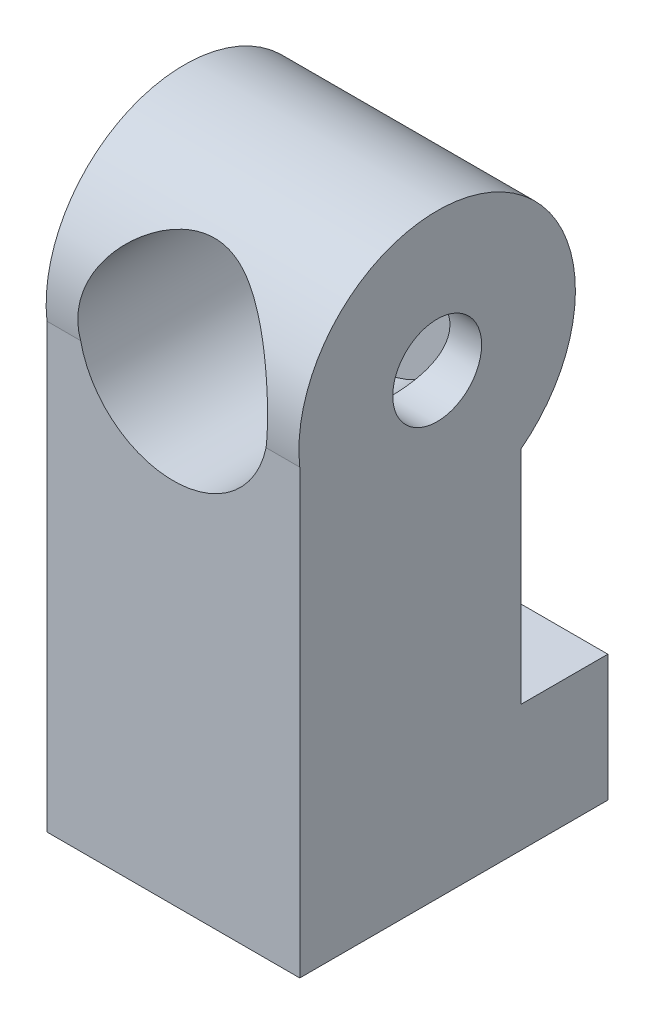
ISO-10303-21;
HEADER;
FILE_DESCRIPTION(('STEP AP214'),'2;1');
FILE_NAME('part.step','',(''),(''),'','','');
FILE_SCHEMA(('AUTOMOTIVE_DESIGN { 1 0 10303 214 1 1 1 1 }'));
ENDSEC;
DATA;
#1=APPLICATION_CONTEXT('core data for automotive mechanical design processes');
#2=APPLICATION_PROTOCOL_DEFINITION('international standard','automotive_design',2000,#1);
#3=PRODUCT_CONTEXT('',#1,'mechanical');
#4=PRODUCT('Part','Part','',(#3));
#5=PRODUCT_RELATED_PRODUCT_CATEGORY('part','',(#4));
#6=PRODUCT_DEFINITION_FORMATION('','',#4);
#7=PRODUCT_DEFINITION_CONTEXT('part definition',#1,'design');
#8=PRODUCT_DEFINITION('design','',#6,#7);
#9=PRODUCT_DEFINITION_SHAPE('','',#8);
#10=(LENGTH_UNIT() NAMED_UNIT(*) SI_UNIT(.MILLI.,.METRE.));
#11=(NAMED_UNIT(*) PLANE_ANGLE_UNIT() SI_UNIT($,.RADIAN.));
#12=(NAMED_UNIT(*) SI_UNIT($,.STERADIAN.) SOLID_ANGLE_UNIT());
#13=UNCERTAINTY_MEASURE_WITH_UNIT(LENGTH_MEASURE(1.E-05),#10,'distance_accuracy_value','');
#14=(GEOMETRIC_REPRESENTATION_CONTEXT(3) GLOBAL_UNCERTAINTY_ASSIGNED_CONTEXT((#13)) GLOBAL_UNIT_ASSIGNED_CONTEXT((#10,
#11,#12)) REPRESENTATION_CONTEXT('',''));
#15=CARTESIAN_POINT('',(0.,0.,0.));
#16=DIRECTION('',(0.,0.,1.));
#17=DIRECTION('',(1.,0.,0.));
#18=AXIS2_PLACEMENT_3D('',#15,#16,#17);
#19=CARTESIAN_POINT('',(6.4,0.,-7.8));
#20=DIRECTION('',(0.,0.,1.));
#21=DIRECTION('',(1.,0.,0.));
#22=AXIS2_PLACEMENT_3D('',#19,#20,#21);
#23=PLANE('',#22);
#24=DIRECTION('',(0.,1.,0.));
#25=VECTOR('',#24,1.);
#26=CARTESIAN_POINT('',(0.,0.,-7.8));
#27=LINE('',#26,#25);
#28=CARTESIAN_POINT('',(0.,0.,-7.8));
#29=VERTEX_POINT('',#28);
#30=CARTESIAN_POINT('',(0.,3.2,-7.8));
#31=VERTEX_POINT('',#30);
#32=EDGE_CURVE('E238',#29,#31,#27,.T.);
#33=ORIENTED_EDGE('',*,*,#32,.T.);
#34=DIRECTION('',(-1.,0.,0.));
#35=VECTOR('',#34,1.);
#36=CARTESIAN_POINT('',(6.4,3.2,-7.8));
#37=LINE('',#36,#35);
#38=CARTESIAN_POINT('',(6.4,3.2,-7.8));
#39=VERTEX_POINT('',#38);
#40=EDGE_CURVE('E11',#39,#31,#37,.T.);
#41=ORIENTED_EDGE('',*,*,#40,.F.);
#42=DIRECTION('',(0.,1.,0.));
#43=VECTOR('',#42,1.);
#44=CARTESIAN_POINT('',(6.4,0.,-7.8));
#45=LINE('',#44,#43);
#46=CARTESIAN_POINT('',(6.4,0.,-7.8));
#47=VERTEX_POINT('',#46);
#48=EDGE_CURVE('E260',#47,#39,#45,.T.);
#49=ORIENTED_EDGE('',*,*,#48,.F.);
#50=DIRECTION('',(-1.,0.,0.));
#51=VECTOR('',#50,1.);
#52=CARTESIAN_POINT('',(6.4,0.,-7.8));
#53=LINE('',#52,#51);
#54=EDGE_CURVE('E241',#47,#29,#53,.T.);
#55=ORIENTED_EDGE('',*,*,#54,.T.);
#56=EDGE_LOOP('',(#33,#41,#49,#55));
#57=FACE_BOUND('',#56,.T.);
#58=ADVANCED_FACE('F51',(#57),#23,.F.);
#59=CARTESIAN_POINT('',(6.4,3.2,-7.8));
#60=DIRECTION('',(0.,-1.,0.));
#61=DIRECTION('',(0.,0.,-1.));
#62=AXIS2_PLACEMENT_3D('',#59,#60,#61);
#63=PLANE('',#62);
#64=DIRECTION('',(0.,0.,1.));
#65=VECTOR('',#64,1.);
#66=CARTESIAN_POINT('',(0.,3.2,-7.8));
#67=LINE('',#66,#65);
#68=CARTESIAN_POINT('',(0.,3.2,-5.6));
#69=VERTEX_POINT('',#68);
#70=EDGE_CURVE('E243',#31,#69,#67,.T.);
#71=ORIENTED_EDGE('',*,*,#70,.T.);
#72=DIRECTION('',(-1.,0.,0.));
#73=VECTOR('',#72,1.);
#74=CARTESIAN_POINT('',(6.4,3.2,-5.6));
#75=LINE('',#74,#73);
#76=CARTESIAN_POINT('',(6.4,3.2,-5.6));
#77=VERTEX_POINT('',#76);
#78=EDGE_CURVE('E64',#77,#69,#75,.T.);
#79=ORIENTED_EDGE('',*,*,#78,.F.);
#80=DIRECTION('',(0.,0.,1.));
#81=VECTOR('',#80,1.);
#82=CARTESIAN_POINT('',(6.4,3.2,-7.8));
#83=LINE('',#82,#81);
#84=EDGE_CURVE('E288',#39,#77,#83,.T.);
#85=ORIENTED_EDGE('',*,*,#84,.F.);
#86=ORIENTED_EDGE('',*,*,#40,.T.);
#87=EDGE_LOOP('',(#71,#79,#85,#86));
#88=FACE_BOUND('',#87,.T.);
#89=ADVANCED_FACE('F228',(#88),#63,.F.);
#90=CARTESIAN_POINT('',(6.4,3.2,-5.6));
#91=DIRECTION('',(0.,0.,1.));
#92=DIRECTION('',(0.,-1.,0.));
#93=AXIS2_PLACEMENT_3D('',#90,#91,#92);
#94=PLANE('',#93);
#95=DIRECTION('',(0.,1.,0.));
#96=VECTOR('',#95,1.);
#97=CARTESIAN_POINT('',(0.,3.2,-5.6));
#98=LINE('',#97,#96);
#99=CARTESIAN_POINT('',(0.,8.8,-5.6));
#100=VERTEX_POINT('',#99);
#101=EDGE_CURVE('E245',#69,#100,#98,.T.);
#102=ORIENTED_EDGE('',*,*,#101,.T.);
#103=DIRECTION('',(-1.,0.,0.));
#104=VECTOR('',#103,1.);
#105=CARTESIAN_POINT('',(6.4,8.8,-5.6));
#106=LINE('',#105,#104);
#107=CARTESIAN_POINT('',(6.4,8.8,-5.6));
#108=VERTEX_POINT('',#107);
#109=EDGE_CURVE('E268',#108,#100,#106,.T.);
#110=ORIENTED_EDGE('',*,*,#109,.F.);
#111=DIRECTION('',(0.,1.,0.));
#112=VECTOR('',#111,1.);
#113=CARTESIAN_POINT('',(6.4,3.2,-5.6));
#114=LINE('',#113,#112);
#115=EDGE_CURVE('E277',#77,#108,#114,.T.);
#116=ORIENTED_EDGE('',*,*,#115,.F.);
#117=ORIENTED_EDGE('',*,*,#78,.T.);
#118=EDGE_LOOP('',(#102,#110,#116,#117));
#119=FACE_BOUND('',#118,.T.);
#120=ADVANCED_FACE('F224',(#119),#94,.F.);
#121=CARTESIAN_POINT('',(6.4,11.5840258618578,-3.4788682265105));
#122=DIRECTION('',(-1.,0.,0.));
#123=DIRECTION('',(0.,0.,1.));
#124=AXIS2_PLACEMENT_3D('',#121,#122,#123);
#125=CYLINDRICAL_SURFACE('',#124,3.5);
#126=DIRECTION('',(-1.,0.,0.));
#127=VECTOR('',#126,1.);
#128=CARTESIAN_POINT('',(6.4,11.2,0.));
#129=LINE('',#128,#127);
#130=CARTESIAN_POINT('',(0.852661081138903,11.2,0.));
#131=VERTEX_POINT('',#130);
#132=CARTESIAN_POINT('',(0.,11.2,0.));
#133=VERTEX_POINT('',#132);
#134=EDGE_CURVE('E265',#131,#133,#129,.T.);
#135=ORIENTED_EDGE('',*,*,#134,.F.);
#136=CARTESIAN_POINT('',(0.852661081138903,11.2,0.));
#137=CARTESIAN_POINT('',(0.840792293346237,11.2556738277083,0.00615618650246647));
#138=CARTESIAN_POINT('',(0.830892766927941,11.3119160095123,0.0110015941913063));
#139=CARTESIAN_POINT('',(0.815110303502944,11.4251260777878,0.0179801161433692));
#140=CARTESIAN_POINT('',(0.809227320363557,11.4820939559166,0.0201132615589809));
#141=CARTESIAN_POINT('',(0.80157104908777,11.5961176248204,0.0215737472807599));
#142=CARTESIAN_POINT('',(0.799781445972068,11.6531721564266,0.0209122563085122));
#143=CARTESIAN_POINT('',(0.800261552975996,11.7671450125878,0.0168042527183595));
#144=CARTESIAN_POINT('',(0.802531011672886,11.8240633453604,0.0133579126043134));
#145=CARTESIAN_POINT('',(0.815380909087971,11.9940544139057,-0.00111634999396108));
#146=CARTESIAN_POINT('',(0.832000500817748,12.10639939998,-0.0162790810085897));
#147=CARTESIAN_POINT('',(0.880312547670731,12.3258753161952,-0.0565651958182519));
#148=CARTESIAN_POINT('',(0.912013416300616,12.4330032990667,-0.0816941382362155));
#149=CARTESIAN_POINT('',(0.989988504379228,12.6427122302376,-0.140997585663571));
#150=CARTESIAN_POINT('',(1.03664120934427,12.7450857404032,-0.17540285052558));
#151=CARTESIAN_POINT('',(1.14244402315444,12.9404948285297,-0.250714467355236));
#152=CARTESIAN_POINT('',(1.20159765209792,13.0335277653988,-0.29162264965456));
#153=CARTESIAN_POINT('',(1.34142019627974,13.2237448020704,-0.384635728245926));
#154=CARTESIAN_POINT('',(1.42402381716511,13.3191411164894,-0.437479398858617));
#155=CARTESIAN_POINT('',(1.6026286577345,13.4956102104736,-0.545176969969943));
#156=CARTESIAN_POINT('',(1.69865991915841,13.5766499219027,-0.600035168846446));
#157=CARTESIAN_POINT('',(1.86002813647221,13.6924280478097,-0.68469247841013));
#158=CARTESIAN_POINT('',(1.92128804897133,13.7323050685919,-0.715327326149803));
#159=CARTESIAN_POINT('',(2.04784784601227,13.8066440389178,-0.77475368183762));
#160=CARTESIAN_POINT('',(2.1131490474489,13.8411042102392,-0.803544582631744));
#161=CARTESIAN_POINT('',(2.31463157585771,13.9356202222924,-0.885243175769366));
#162=CARTESIAN_POINT('',(2.4569681619758,13.9872308836361,-0.933800446820765));
#163=CARTESIAN_POINT('',(2.69816643388576,14.0488934090757,-0.993803378154266));
#164=CARTESIAN_POINT('',(2.79317022247037,14.0672782999088,-1.0123388545372));
#165=CARTESIAN_POINT('',(2.98617258953903,14.092425975245,-1.03791303262966));
#166=CARTESIAN_POINT('',(3.08416572381198,14.0992087375294,-1.04497149564568));
#167=CARTESIAN_POINT('',(3.28054729705155,14.1006615605423,-1.04647254455566));
#168=CARTESIAN_POINT('',(3.37893613355414,14.0953058590704,-1.04088829808512));
#169=CARTESIAN_POINT('',(3.57301216932402,14.0728544934742,-1.01797954531402));
#170=CARTESIAN_POINT('',(3.66869540391411,14.0557424450877,-1.000638654782));
#171=CARTESIAN_POINT('',(3.88078763205757,14.0046634203404,-0.950608373712786));
#172=CARTESIAN_POINT('',(3.99569201112349,13.967362907782,-0.915015386628906));
#173=CARTESIAN_POINT('',(4.21592733276386,13.877638288311,-0.834444613620233));
#174=CARTESIAN_POINT('',(4.32123614921084,13.8251803359318,-0.789445888255347));
#175=CARTESIAN_POINT('',(4.547718440401,13.6912714191813,-0.682691878769425));
#176=CARTESIAN_POINT('',(4.66591506819168,13.6058291996055,-0.619618867984155));
#177=CARTESIAN_POINT('',(4.88519572570754,13.4150133540185,-0.493803861168845));
#178=CARTESIAN_POINT('',(4.98626798994013,13.3096261289623,-0.431062121187041));
#179=CARTESIAN_POINT('',(5.16946333606693,13.0794342401466,-0.311764595061694));
#180=CARTESIAN_POINT('',(5.25152283052074,12.9545666899694,-0.255229890501797));
#181=CARTESIAN_POINT('',(5.35708199023806,12.7548307560407,-0.179731844885718));
#182=CARTESIAN_POINT('',(5.3893322261386,12.6862257266232,-0.156128171582241));
#183=CARTESIAN_POINT('',(5.44751416759658,12.545274773158,-0.112648784357802));
#184=CARTESIAN_POINT('',(5.47344870231844,12.4729305417842,-0.0927714021395947));
#185=CARTESIAN_POINT('',(5.52849534527345,12.292090667837,-0.049481448349924));
#186=CARTESIAN_POINT('',(5.55387766967909,12.1818451350743,-0.0284377096836897));
#187=CARTESIAN_POINT('',(5.58884557576572,11.9574628249701,0.00299246324960673));
#188=CARTESIAN_POINT('',(5.59844568859202,11.8433297259872,0.0133886976567457));
#189=CARTESIAN_POINT('',(5.60089727934255,11.6400881888514,0.0218136252109638));
#190=CARTESIAN_POINT('',(5.59701929540537,11.5511021001347,0.0220913400978736));
#191=CARTESIAN_POINT('',(5.58385360655739,11.4185367026676,0.0174980753284493));
#192=CARTESIAN_POINT('',(5.57823387307489,11.3744706000077,0.0151286644637681));
#193=CARTESIAN_POINT('',(5.56458362295902,11.286826347634,0.00876790048090037));
#194=CARTESIAN_POINT('',(5.55655284918177,11.2432482504818,0.00477637434372134));
#195=CARTESIAN_POINT('',(5.5473389188611,11.2,0.));
#196=B_SPLINE_CURVE_WITH_KNOTS('',3,(#136,#137,#138,#139,#140,#141,#142,#143,#144,#145,#146,
#147,#148,#149,#150,#151,#152,#153,#154,#155,#156,#157,#158,#159,#160,#161,#162,#163,#164,#165,
#166,#167,#168,#169,#170,#171,#172,#173,#174,#175,#176,#177,#178,#179,#180,#181,#182,#183,#184,
#185,#186,#187,#188,#189,#190,#191,#192,#193,#194,#195),.UNSPECIFIED.,.F.,.F.,(4,2,2,2,2,2,2,2,
2,2,2,2,2,2,2,2,2,2,2,2,2,2,2,2,2,2,2,2,2,4),(0.,0.171723989401013,0.343446006403999,
0.514482389563074,0.685508178907873,1.02745241853051,1.36958764528835,1.72117673045833,
2.0728649507947,2.48177927619536,2.89162355912204,3.12909781536246,3.36664986665493,
3.83943681847953,4.13385152491645,4.42775876449654,4.72229036527191,5.01723327563622,
5.3929901520559,5.76959263754877,6.24394486008456,6.71862168168708,7.19486383484634,
7.43269228455841,7.67041400049625,8.01401878203673,8.35730701902312,8.62368382073456,
8.75705540094371,8.89044121064439),.UNSPECIFIED.);
#197=CARTESIAN_POINT('',(5.5473389188611,11.2,0.));
#198=VERTEX_POINT('',#197);
#199=EDGE_CURVE('E78',#131,#198,#196,.T.);
#200=ORIENTED_EDGE('',*,*,#199,.T.);
#201=CARTESIAN_POINT('',(6.4,11.2,0.));
#202=VERTEX_POINT('',#201);
#203=EDGE_CURVE('E266',#202,#198,#129,.T.);
#204=ORIENTED_EDGE('',*,*,#203,.F.);
#205=CARTESIAN_POINT('',(6.4,11.5840258618578,-3.4788682265105));
#206=DIRECTION('',(1.,0.,0.));
#207=DIRECTION('',(0.,0.,-1.));
#208=AXIS2_PLACEMENT_3D('',#205,#206,#207);
#209=CIRCLE('',#208,3.5);
#210=EDGE_CURVE('E283',#108,#202,#209,.T.);
#211=ORIENTED_EDGE('',*,*,#210,.F.);
#212=ORIENTED_EDGE('',*,*,#109,.T.);
#213=CARTESIAN_POINT('',(0.,11.5840258618578,-3.4788682265105));
#214=DIRECTION('',(1.,0.,0.));
#215=DIRECTION('',(0.,0.,-1.));
#216=AXIS2_PLACEMENT_3D('',#213,#214,#215);
#217=CIRCLE('',#216,3.5);
#218=EDGE_CURVE('E253',#100,#133,#217,.T.);
#219=ORIENTED_EDGE('',*,*,#218,.T.);
#220=EDGE_LOOP('',(#135,#200,#204,#211,#212,#219));
#221=FACE_BOUND('',#220,.T.);
#222=ADVANCED_FACE('F190',(#221),#125,.T.);
#223=CARTESIAN_POINT('',(6.4,11.2,0.));
#224=DIRECTION('',(0.,0.,-1.));
#225=DIRECTION('',(0.,1.,0.));
#226=AXIS2_PLACEMENT_3D('',#223,#224,#225);
#227=PLANE('',#226);
#228=ORIENTED_EDGE('',*,*,#203,.T.);
#229=CARTESIAN_POINT('',(3.2,11.7,0.));
#230=DIRECTION('',(0.,0.,-1.));
#231=DIRECTION('',(0.,1.,0.));
#232=AXIS2_PLACEMENT_3D('',#229,#230,#231);
#233=CIRCLE('',#232,2.4);
#234=EDGE_CURVE('E180',#198,#131,#233,.T.);
#235=ORIENTED_EDGE('',*,*,#234,.T.);
#236=ORIENTED_EDGE('',*,*,#134,.T.);
#237=DIRECTION('',(0.,-1.,0.));
#238=VECTOR('',#237,1.);
#239=CARTESIAN_POINT('',(0.,11.2,0.));
#240=LINE('',#239,#238);
#241=CARTESIAN_POINT('',(0.,0.,0.));
#242=VERTEX_POINT('',#241);
#243=EDGE_CURVE('E256',#133,#242,#240,.T.);
#244=ORIENTED_EDGE('',*,*,#243,.T.);
#245=DIRECTION('',(-1.,0.,0.));
#246=VECTOR('',#245,1.);
#247=CARTESIAN_POINT('',(6.4,0.,0.));
#248=LINE('',#247,#246);
#249=CARTESIAN_POINT('',(6.4,0.,0.));
#250=VERTEX_POINT('',#249);
#251=EDGE_CURVE('E262',#250,#242,#248,.T.);
#252=ORIENTED_EDGE('',*,*,#251,.F.);
#253=DIRECTION('',(0.,-1.,0.));
#254=VECTOR('',#253,1.);
#255=CARTESIAN_POINT('',(6.4,11.2,0.));
#256=LINE('',#255,#254);
#257=EDGE_CURVE('E286',#202,#250,#256,.T.);
#258=ORIENTED_EDGE('',*,*,#257,.F.);
#259=EDGE_LOOP('',(#228,#235,#236,#244,#252,#258));
#260=FACE_BOUND('',#259,.T.);
#261=ADVANCED_FACE('F217',(#260),#227,.F.);
#262=CARTESIAN_POINT('',(6.4,0.,0.));
#263=DIRECTION('',(0.,1.,0.));
#264=DIRECTION('',(0.,0.,1.));
#265=AXIS2_PLACEMENT_3D('',#262,#263,#264);
#266=PLANE('',#265);
#267=DIRECTION('',(1.,0.,0.));
#268=VECTOR('',#267,1.);
#269=CARTESIAN_POINT('',(5.6,0.,-4.7));
#270=LINE('',#269,#268);
#271=CARTESIAN_POINT('',(0.8,0.,-4.7));
#272=VERTEX_POINT('',#271);
#273=CARTESIAN_POINT('',(5.6,0.,-4.7));
#274=VERTEX_POINT('',#273);
#275=EDGE_CURVE('E168',#272,#274,#270,.T.);
#276=ORIENTED_EDGE('',*,*,#275,.F.);
#277=DIRECTION('',(0.,0.,-1.));
#278=VECTOR('',#277,1.);
#279=CARTESIAN_POINT('',(0.8,0.,-1.4));
#280=LINE('',#279,#278);
#281=CARTESIAN_POINT('',(0.8,0.,-1.4));
#282=VERTEX_POINT('',#281);
#283=EDGE_CURVE('E71',#282,#272,#280,.T.);
#284=ORIENTED_EDGE('',*,*,#283,.F.);
#285=DIRECTION('',(-1.,0.,0.));
#286=VECTOR('',#285,1.);
#287=CARTESIAN_POINT('',(5.6,0.,-1.4));
#288=LINE('',#287,#286);
#289=CARTESIAN_POINT('',(5.6,0.,-1.4));
#290=VERTEX_POINT('',#289);
#291=EDGE_CURVE('E159',#290,#282,#288,.T.);
#292=ORIENTED_EDGE('',*,*,#291,.F.);
#293=DIRECTION('',(0.,0.,1.));
#294=VECTOR('',#293,1.);
#295=CARTESIAN_POINT('',(5.6,0.,-1.4));
#296=LINE('',#295,#294);
#297=EDGE_CURVE('E162',#274,#290,#296,.T.);
#298=ORIENTED_EDGE('',*,*,#297,.F.);
#299=EDGE_LOOP('',(#276,#284,#292,#298));
#300=FACE_BOUND('',#299,.T.);
#301=DIRECTION('',(0.,0.,-1.));
#302=VECTOR('',#301,1.);
#303=CARTESIAN_POINT('',(0.,0.,0.));
#304=LINE('',#303,#302);
#305=EDGE_CURVE('E258',#242,#29,#304,.T.);
#306=ORIENTED_EDGE('',*,*,#305,.T.);
#307=ORIENTED_EDGE('',*,*,#54,.F.);
#308=DIRECTION('',(0.,0.,-1.));
#309=VECTOR('',#308,1.);
#310=CARTESIAN_POINT('',(6.4,0.,0.));
#311=LINE('',#310,#309);
#312=EDGE_CURVE('E249',#250,#47,#311,.T.);
#313=ORIENTED_EDGE('',*,*,#312,.F.);
#314=ORIENTED_EDGE('',*,*,#251,.T.);
#315=EDGE_LOOP('',(#306,#307,#313,#314));
#316=FACE_BOUND('',#315,.T.);
#317=ADVANCED_FACE('F211',(#300,#316),#266,.F.);
#318=CARTESIAN_POINT('',(6.4,11.5840258618578,-3.4788682265105));
#319=DIRECTION('',(1.,0.,0.));
#320=DIRECTION('',(0.,0.,-1.));
#321=AXIS2_PLACEMENT_3D('',#318,#319,#320);
#322=PLANE('',#321);
#323=CARTESIAN_POINT('',(6.4,11.5840258618578,-3.4788682265105));
#324=DIRECTION('',(1.,0.,0.));
#325=DIRECTION('',(0.,0.,-1.));
#326=AXIS2_PLACEMENT_3D('',#323,#324,#325);
#327=CIRCLE('',#326,1.125);
#328=CARTESIAN_POINT('',(6.4,11.5840258618578,-4.6038682265105));
#329=VERTEX_POINT('',#328);
#330=EDGE_CURVE('E188',#329,#329,#327,.T.);
#331=ORIENTED_EDGE('',*,*,#330,.F.);
#332=EDGE_LOOP('',(#331));
#333=FACE_BOUND('',#332,.T.);
#334=ORIENTED_EDGE('',*,*,#48,.T.);
#335=ORIENTED_EDGE('',*,*,#84,.T.);
#336=ORIENTED_EDGE('',*,*,#115,.T.);
#337=ORIENTED_EDGE('',*,*,#210,.T.);
#338=ORIENTED_EDGE('',*,*,#257,.T.);
#339=ORIENTED_EDGE('',*,*,#312,.T.);
#340=EDGE_LOOP('',(#334,#335,#336,#337,#338,#339));
#341=FACE_BOUND('',#340,.T.);
#342=ADVANCED_FACE('F208',(#333,#341),#322,.T.);
#343=CARTESIAN_POINT('',(0.,11.5840258618578,-3.4788682265105));
#344=DIRECTION('',(1.,0.,0.));
#345=DIRECTION('',(0.,0.,-1.));
#346=AXIS2_PLACEMENT_3D('',#343,#344,#345);
#347=PLANE('',#346);
#348=ORIENTED_EDGE('',*,*,#32,.F.);
#349=ORIENTED_EDGE('',*,*,#305,.F.);
#350=ORIENTED_EDGE('',*,*,#243,.F.);
#351=ORIENTED_EDGE('',*,*,#218,.F.);
#352=ORIENTED_EDGE('',*,*,#101,.F.);
#353=ORIENTED_EDGE('',*,*,#70,.F.);
#354=EDGE_LOOP('',(#348,#349,#350,#351,#352,#353));
#355=FACE_BOUND('',#354,.T.);
#356=ADVANCED_FACE('F206',(#355),#347,.F.);
#357=CARTESIAN_POINT('',(4.4,11.5840258618578,-3.4788682265105));
#358=DIRECTION('',(1.,0.,0.));
#359=DIRECTION('',(0.,0.,-1.));
#360=AXIS2_PLACEMENT_3D('',#357,#358,#359);
#361=CYLINDRICAL_SURFACE('',#360,1.125);
#362=CARTESIAN_POINT('',(5.59719627883955,11.5840258618578,-4.6038682265105));
#363=CARTESIAN_POINT('',(5.59427503568601,11.5236998748837,-4.60386503653355));
#364=CARTESIAN_POINT('',(5.58905210179077,11.4633954270214,-4.59898670975711));
#365=CARTESIAN_POINT('',(5.5743218710308,11.3447697342202,-4.57978142466184));
#366=CARTESIAN_POINT('',(5.5648041855985,11.2864536690491,-4.56543151637126));
#367=CARTESIAN_POINT('',(5.54228406811998,11.1736951561263,-4.52804217643795));
#368=CARTESIAN_POINT('',(5.52929672890404,11.1192371939856,-4.50504020812859));
#369=CARTESIAN_POINT('',(5.50083622660623,11.0151132443282,-4.45118608751494));
#370=CARTESIAN_POINT('',(5.48536360297121,10.9654462206436,-4.42033563792716));
#371=CARTESIAN_POINT('',(5.4520386656732,10.8686702833571,-4.34934212529888));
#372=CARTESIAN_POINT('',(5.43409688153176,10.8219415538139,-4.30872301659574));
#373=CARTESIAN_POINT('',(5.39825553474991,10.7357088414585,-4.22035285459395));
#374=CARTESIAN_POINT('',(5.38035601851617,10.6962107858982,-4.17259600795506));
#375=CARTESIAN_POINT('',(5.34521763397803,10.6230636219626,-4.0675358381072));
#376=CARTESIAN_POINT('',(5.32809425961864,10.5899502462235,-4.00981727343367));
#377=CARTESIAN_POINT('',(5.29804866437329,10.534150817495,-3.88853903953736));
#378=CARTESIAN_POINT('',(5.28512215297769,10.5114541055265,-3.82498542140258));
#379=CARTESIAN_POINT('',(5.26631700618769,10.4790740457501,-3.69925069685967));
#380=CARTESIAN_POINT('',(5.25994977852162,10.4684807689214,-3.63737996344285));
#381=CARTESIAN_POINT('',(5.25352047931649,10.4577847210202,-3.5124358953973));
#382=CARTESIAN_POINT('',(5.25345254542066,10.45767219617,-3.44936373355159));
#383=CARTESIAN_POINT('',(5.2592269212396,10.4672781823903,-3.33215167020747));
#384=CARTESIAN_POINT('',(5.2643413488661,10.475785934956,-3.27786950450707));
#385=CARTESIAN_POINT('',(5.27874926023561,10.5004153506345,-3.17164292548555));
#386=CARTESIAN_POINT('',(5.28804408308577,10.5165394535782,-3.11969926712916));
#387=CARTESIAN_POINT('',(5.31016714836939,10.5564403962688,-3.01756334746316));
#388=CARTESIAN_POINT('',(5.32310400655172,10.5804570370807,-2.96748927283877));
#389=CARTESIAN_POINT('',(5.35110322632575,10.6352461585047,-2.87183972865987));
#390=CARTESIAN_POINT('',(5.36616656494112,10.6660217481871,-2.8262663434234));
#391=CARTESIAN_POINT('',(5.39929507882386,10.7382905630724,-2.73440955159591));
#392=CARTESIAN_POINT('',(5.41749021836008,10.7806714573843,-2.68886901934565));
#393=CARTESIAN_POINT('',(5.45336321422796,10.8724829319528,-2.60526108952028));
#394=CARTESIAN_POINT('',(5.47104078922944,10.9219172635145,-2.56719769435887));
#395=CARTESIAN_POINT('',(5.50528502811888,11.0298938197844,-2.49758583254273));
#396=CARTESIAN_POINT('',(5.52173233805914,11.0887930105403,-2.46652751077574));
#397=CARTESIAN_POINT('',(5.55070633543802,11.2119723202044,-2.41507929214358));
#398=CARTESIAN_POINT('',(5.56323577909977,11.2762486157807,-2.39468188849701));
#399=CARTESIAN_POINT('',(5.58237231342718,11.4031758018193,-2.36674640109346));
#400=CARTESIAN_POINT('',(5.58935653683527,11.4655801693979,-2.35835027186142));
#401=CARTESIAN_POINT('',(5.59836111641309,11.591258526578,-2.35213638008971));
#402=CARTESIAN_POINT('',(5.60038411183566,11.6545320357932,-2.35431299127098));
#403=CARTESIAN_POINT('',(5.59952991305004,11.7746255372717,-2.36861931740942));
#404=CARTESIAN_POINT('',(5.59704030805388,11.8315498012826,-2.37991964980942));
#405=CARTESIAN_POINT('',(5.58834604163984,11.9427194663538,-2.41102186840167));
#406=CARTESIAN_POINT('',(5.58214115103642,11.9969647019288,-2.43082427904191));
#407=CARTESIAN_POINT('',(5.56666713397811,12.10219232262,-2.47860954593365));
#408=CARTESIAN_POINT('',(5.5573551570658,12.1531164541508,-2.50670612630503));
#409=CARTESIAN_POINT('',(5.53670746560008,12.2497674361553,-2.57015565715288));
#410=CARTESIAN_POINT('',(5.52537098197962,12.2954923006962,-2.60551136598463));
#411=CARTESIAN_POINT('',(5.50087785208001,12.3842866806517,-2.68573128732254));
#412=CARTESIAN_POINT('',(5.48764815131561,12.4268555406099,-2.73112818910984));
#413=CARTESIAN_POINT('',(5.46168375686181,12.5040197628241,-2.82841191562512));
#414=CARTESIAN_POINT('',(5.44894927497159,12.5386117439773,-2.8803014780286));
#415=CARTESIAN_POINT('',(5.42508777705157,12.6000642633892,-2.9915503733329));
#416=CARTESIAN_POINT('',(5.41404059567096,12.6265795985655,-3.05111912376134));
#417=CARTESIAN_POINT('',(5.39580201317701,12.6690174451843,-3.17446234377157));
#418=CARTESIAN_POINT('',(5.38860754691541,12.6849483798144,-3.23823342455532));
#419=CARTESIAN_POINT('',(5.37957648705086,12.7047673604224,-3.3635128732865));
#420=CARTESIAN_POINT('',(5.37740783442703,12.7094028928169,-3.42487877405628));
#421=CARTESIAN_POINT('',(5.37777988888969,12.7086010452623,-3.5475217261634));
#422=CARTESIAN_POINT('',(5.38031939967739,12.7031662240929,-3.60879879611262));
#423=CARTESIAN_POINT('',(5.38942483237971,12.6831209082167,-3.72569287423097));
#424=CARTESIAN_POINT('',(5.39574067475723,12.6690790503203,-3.78142914038553));
#425=CARTESIAN_POINT('',(5.41136734023517,12.6328670435783,-3.88974604024959));
#426=CARTESIAN_POINT('',(5.42067901428647,12.6106945850262,-3.94232577232026));
#427=CARTESIAN_POINT('',(5.44178944182351,12.5574618731686,-4.04598851653135));
#428=CARTESIAN_POINT('',(5.45369596682053,12.5259836039807,-4.09683435298432));
#429=CARTESIAN_POINT('',(5.47829179345431,12.4554989092288,-4.19280629090834));
#430=CARTESIAN_POINT('',(5.49098140263382,12.4164895129781,-4.23793012363376));
#431=CARTESIAN_POINT('',(5.51674285951374,12.3284596493027,-4.32477215522217));
#432=CARTESIAN_POINT('',(5.52976870919507,12.2788991238743,-4.36595930578081));
#433=CARTESIAN_POINT('',(5.5535389551452,12.1730653810064,-4.43949681442083));
#434=CARTESIAN_POINT('',(5.564282626037,12.1167900381513,-4.47184436382041));
#435=CARTESIAN_POINT('',(5.58186521955255,12.0002051240753,-4.52599208969475));
#436=CARTESIAN_POINT('',(5.58877847366114,11.939999715173,-4.54799169645914));
#437=CARTESIAN_POINT('',(5.59796539261416,11.8164877238476,-4.58143615109145));
#438=CARTESIAN_POINT('',(5.60025232450305,11.7531905439682,-4.59291112887781));
#439=CARTESIAN_POINT('',(5.59990121522555,11.6719595979114,-4.60056586742036));
#440=CARTESIAN_POINT('',(5.59963107056676,11.6543894823292,-4.60180365794691));
#441=CARTESIAN_POINT('',(5.59870464816884,11.6192209203101,-4.60345529002553));
#442=CARTESIAN_POINT('',(5.59804838234512,11.6016224747641,-4.60386915700153));
#443=CARTESIAN_POINT('',(5.59719627883955,11.5840258618578,-4.6038682265105));
#444=B_SPLINE_CURVE_WITH_KNOTS('',3,(#362,#363,#364,#365,#366,#367,#368,#369,#370,#371,#372,
#373,#374,#375,#376,#377,#378,#379,#380,#381,#382,#383,#384,#385,#386,#387,#388,#389,#390,#391,
#392,#393,#394,#395,#396,#397,#398,#399,#400,#401,#402,#403,#404,#405,#406,#407,#408,#409,#410,
#411,#412,#413,#414,#415,#416,#417,#418,#419,#420,#421,#422,#423,#424,#425,#426,#427,#428,#429,
#430,#431,#432,#433,#434,#435,#436,#437,#438,#439,#440,#441,#442,#443),.UNSPECIFIED.,.T.,.F.,(4,
2,2,2,2,2,2,2,2,2,2,2,2,2,2,2,2,2,2,2,2,2,2,2,2,2,2,2,2,2,2,2,2,2,2,2,2,2,2,2,4),(0.,
0.181117030614973,0.36267453310764,0.543454777760867,0.724195835801109,0.916766336242543,
1.1094939938332,1.31454943355957,1.51939457738703,1.70754270685981,1.89551573693542,
2.06030589252598,2.2251488730306,2.3955524806459,2.56603463754919,2.75965142189522,
2.95337156603571,3.15804663184726,3.36257738288514,3.55159412325555,3.74051028947552,
3.91396112082936,4.08742265297981,4.26338275901869,4.43940985130182,4.62944107279056,
4.81955269400829,5.01691528782482,5.21412062948787,5.39787137148979,5.58157543060421,
5.75428470648427,5.92704308293808,6.10920314727741,6.29143521282084,6.48772157920871,
6.68407024101075,6.87646174321314,7.06830073185066,7.12113276636966,7.17396317061705),.UNSPECIFIED.);
#445=CARTESIAN_POINT('',(5.59719627883955,11.5840258618578,-4.6038682265105));
#446=VERTEX_POINT('',#445);
#447=EDGE_CURVE('E54',#446,#446,#444,.T.);
#448=ORIENTED_EDGE('',*,*,#447,.T.);
#449=EDGE_LOOP('',(#448));
#450=FACE_BOUND('',#449,.T.);
#451=ORIENTED_EDGE('',*,*,#330,.T.);
#452=EDGE_LOOP('',(#451));
#453=FACE_BOUND('',#452,.T.);
#454=ADVANCED_FACE('F199',(#450,#453),#361,.F.);
#455=CARTESIAN_POINT('',(3.2,11.7,-5.));
#456=DIRECTION('',(0.,0.,1.));
#457=DIRECTION('',(1.,0.,0.));
#458=AXIS2_PLACEMENT_3D('',#455,#456,#457);
#459=CYLINDRICAL_SURFACE('',#458,2.4);
#460=ORIENTED_EDGE('',*,*,#447,.F.);
#461=EDGE_LOOP('',(#460));
#462=FACE_BOUND('',#461,.T.);
#463=CARTESIAN_POINT('',(3.2,11.7,-5.));
#464=DIRECTION('',(0.,0.,1.));
#465=DIRECTION('',(1.,0.,0.));
#466=AXIS2_PLACEMENT_3D('',#463,#464,#465);
#467=CIRCLE('',#466,2.4);
#468=CARTESIAN_POINT('',(5.6,11.7,-5.));
#469=VERTEX_POINT('',#468);
#470=EDGE_CURVE('E174',#469,#469,#467,.T.);
#471=ORIENTED_EDGE('',*,*,#470,.F.);
#472=EDGE_LOOP('',(#471));
#473=FACE_BOUND('',#472,.T.);
#474=ORIENTED_EDGE('',*,*,#234,.F.);
#475=ORIENTED_EDGE('',*,*,#199,.F.);
#476=EDGE_LOOP('',(#474,#475));
#477=FACE_BOUND('',#476,.T.);
#478=ADVANCED_FACE('F194',(#462,#473,#477),#459,.F.);
#479=CARTESIAN_POINT('',(3.2,11.7,-5.));
#480=DIRECTION('',(0.,0.,1.));
#481=DIRECTION('',(1.,0.,0.));
#482=AXIS2_PLACEMENT_3D('',#479,#480,#481);
#483=PLANE('',#482);
#484=ORIENTED_EDGE('',*,*,#470,.T.);
#485=EDGE_LOOP('',(#484));
#486=FACE_BOUND('',#485,.T.);
#487=ADVANCED_FACE('F198',(#486),#483,.T.);
#488=CARTESIAN_POINT('',(0.8,8.9,-1.4));
#489=DIRECTION('',(-1.,0.,0.));
#490=DIRECTION('',(0.,0.,1.));
#491=AXIS2_PLACEMENT_3D('',#488,#489,#490);
#492=PLANE('',#491);
#493=ORIENTED_EDGE('',*,*,#283,.T.);
#494=DIRECTION('',(0.,-1.,0.));
#495=VECTOR('',#494,1.);
#496=CARTESIAN_POINT('',(0.8,8.9,-4.7));
#497=LINE('',#496,#495);
#498=CARTESIAN_POINT('',(0.8,8.9,-4.7));
#499=VERTEX_POINT('',#498);
#500=EDGE_CURVE('E137',#499,#272,#497,.T.);
#501=ORIENTED_EDGE('',*,*,#500,.F.);
#502=DIRECTION('',(0.,0.,-1.));
#503=VECTOR('',#502,1.);
#504=CARTESIAN_POINT('',(0.8,8.9,-1.4));
#505=LINE('',#504,#503);
#506=CARTESIAN_POINT('',(0.8,8.9,-1.4));
#507=VERTEX_POINT('',#506);
#508=EDGE_CURVE('E141',#507,#499,#505,.T.);
#509=ORIENTED_EDGE('',*,*,#508,.F.);
#510=DIRECTION('',(0.,-1.,0.));
#511=VECTOR('',#510,1.);
#512=CARTESIAN_POINT('',(0.8,8.9,-1.4));
#513=LINE('',#512,#511);
#514=EDGE_CURVE('E172',#507,#282,#513,.T.);
#515=ORIENTED_EDGE('',*,*,#514,.T.);
#516=EDGE_LOOP('',(#493,#501,#509,#515));
#517=FACE_BOUND('',#516,.T.);
#518=ADVANCED_FACE('F139',(#517),#492,.F.);
#519=CARTESIAN_POINT('',(5.6,8.9,-1.4));
#520=DIRECTION('',(0.,0.,1.));
#521=DIRECTION('',(1.,0.,0.));
#522=AXIS2_PLACEMENT_3D('',#519,#520,#521);
#523=PLANE('',#522);
#524=ORIENTED_EDGE('',*,*,#291,.T.);
#525=ORIENTED_EDGE('',*,*,#514,.F.);
#526=DIRECTION('',(-1.,0.,0.));
#527=VECTOR('',#526,1.);
#528=CARTESIAN_POINT('',(5.6,8.9,-1.4));
#529=LINE('',#528,#527);
#530=CARTESIAN_POINT('',(5.6,8.9,-1.4));
#531=VERTEX_POINT('',#530);
#532=EDGE_CURVE('E147',#531,#507,#529,.T.);
#533=ORIENTED_EDGE('',*,*,#532,.F.);
#534=DIRECTION('',(0.,-1.,0.));
#535=VECTOR('',#534,1.);
#536=CARTESIAN_POINT('',(5.6,8.9,-1.4));
#537=LINE('',#536,#535);
#538=EDGE_CURVE('E175',#531,#290,#537,.T.);
#539=ORIENTED_EDGE('',*,*,#538,.T.);
#540=EDGE_LOOP('',(#524,#525,#533,#539));
#541=FACE_BOUND('',#540,.T.);
#542=ADVANCED_FACE('F337',(#541),#523,.F.);
#543=CARTESIAN_POINT('',(5.6,8.9,-1.4));
#544=DIRECTION('',(1.,0.,0.));
#545=DIRECTION('',(0.,0.,-1.));
#546=AXIS2_PLACEMENT_3D('',#543,#544,#545);
#547=PLANE('',#546);
#548=ORIENTED_EDGE('',*,*,#297,.T.);
#549=ORIENTED_EDGE('',*,*,#538,.F.);
#550=DIRECTION('',(0.,0.,1.));
#551=VECTOR('',#550,1.);
#552=CARTESIAN_POINT('',(5.6,8.9,-1.4));
#553=LINE('',#552,#551);
#554=CARTESIAN_POINT('',(5.6,8.9,-4.7));
#555=VERTEX_POINT('',#554);
#556=EDGE_CURVE('E155',#555,#531,#553,.T.);
#557=ORIENTED_EDGE('',*,*,#556,.F.);
#558=DIRECTION('',(0.,-1.,0.));
#559=VECTOR('',#558,1.);
#560=CARTESIAN_POINT('',(5.6,8.9,-4.7));
#561=LINE('',#560,#559);
#562=EDGE_CURVE('E146',#555,#274,#561,.T.);
#563=ORIENTED_EDGE('',*,*,#562,.T.);
#564=EDGE_LOOP('',(#548,#549,#557,#563));
#565=FACE_BOUND('',#564,.T.);
#566=ADVANCED_FACE('F344',(#565),#547,.F.);
#567=CARTESIAN_POINT('',(5.6,8.9,-4.7));
#568=DIRECTION('',(0.,0.,-1.));
#569=DIRECTION('',(-1.,0.,0.));
#570=AXIS2_PLACEMENT_3D('',#567,#568,#569);
#571=PLANE('',#570);
#572=ORIENTED_EDGE('',*,*,#275,.T.);
#573=ORIENTED_EDGE('',*,*,#562,.F.);
#574=DIRECTION('',(1.,0.,0.));
#575=VECTOR('',#574,1.);
#576=CARTESIAN_POINT('',(5.6,8.9,-4.7));
#577=LINE('',#576,#575);
#578=EDGE_CURVE('E150',#499,#555,#577,.T.);
#579=ORIENTED_EDGE('',*,*,#578,.F.);
#580=ORIENTED_EDGE('',*,*,#500,.T.);
#581=EDGE_LOOP('',(#572,#573,#579,#580));
#582=FACE_BOUND('',#581,.T.);
#583=ADVANCED_FACE('F151',(#582),#571,.F.);
#584=CARTESIAN_POINT('',(0.,8.9,0.));
#585=DIRECTION('',(0.,1.,0.));
#586=DIRECTION('',(0.,0.,1.));
#587=AXIS2_PLACEMENT_3D('',#584,#585,#586);
#588=PLANE('',#587);
#589=ORIENTED_EDGE('',*,*,#508,.T.);
#590=ORIENTED_EDGE('',*,*,#578,.T.);
#591=ORIENTED_EDGE('',*,*,#556,.T.);
#592=ORIENTED_EDGE('',*,*,#532,.T.);
#593=EDGE_LOOP('',(#589,#590,#591,#592));
#594=FACE_BOUND('',#593,.T.);
#595=ADVANCED_FACE('F157',(#594),#588,.F.);
#596=CLOSED_SHELL('',(#58,#89,#120,#222,#261,#317,#342,#356,#454,#478,#487,#518,#542,#566,#583,#595));
#597=MANIFOLD_SOLID_BREP('B2',#596);
#598=ADVANCED_BREP_SHAPE_REPRESENTATION('',(#18,#597),#14);
#599=SHAPE_DEFINITION_REPRESENTATION(#9,#598);
ENDSEC;
END-ISO-10303-21;
